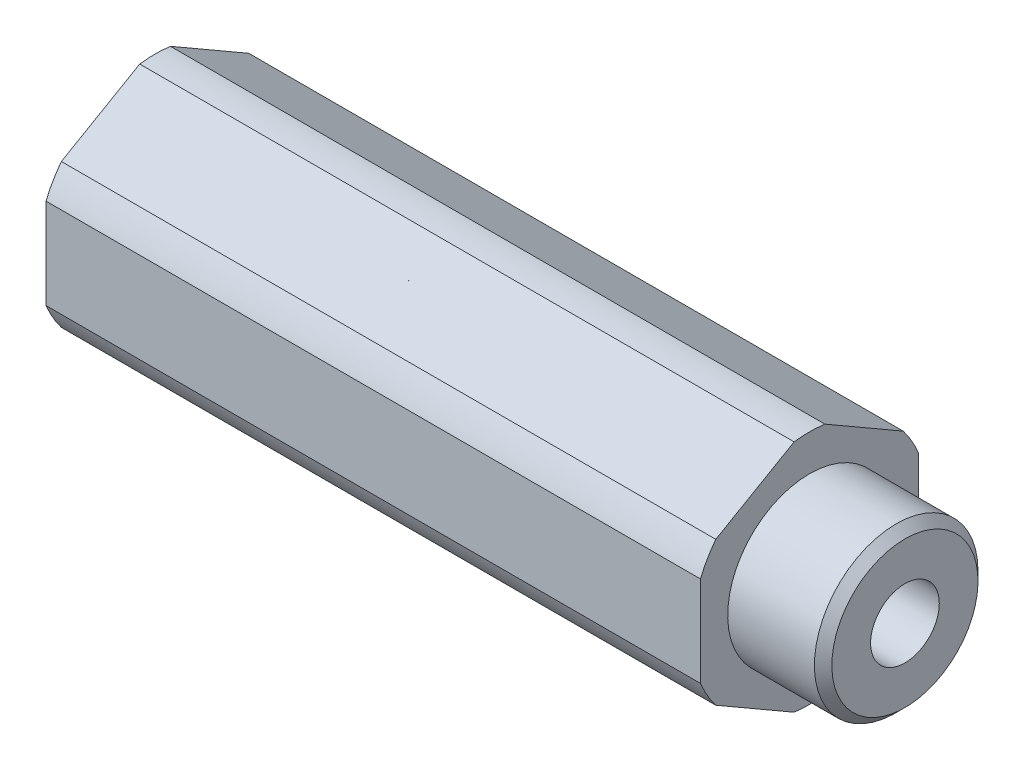
ISO-10303-21;
HEADER;
FILE_DESCRIPTION(('STEP AP214'),'2;1');
FILE_NAME('part.step','',(''),(''),'','','');
FILE_SCHEMA(('AUTOMOTIVE_DESIGN { 1 0 10303 214 1 1 1 1 }'));
ENDSEC;
DATA;
#1=APPLICATION_CONTEXT('core data for automotive mechanical design processes');
#2=APPLICATION_PROTOCOL_DEFINITION('international standard','automotive_design',2000,#1);
#3=PRODUCT_CONTEXT('',#1,'mechanical');
#4=PRODUCT('Part','Part','',(#3));
#5=PRODUCT_RELATED_PRODUCT_CATEGORY('part','',(#4));
#6=PRODUCT_DEFINITION_FORMATION('','',#4);
#7=PRODUCT_DEFINITION_CONTEXT('part definition',#1,'design');
#8=PRODUCT_DEFINITION('design','',#6,#7);
#9=PRODUCT_DEFINITION_SHAPE('','',#8);
#10=(LENGTH_UNIT() NAMED_UNIT(*) SI_UNIT(.MILLI.,.METRE.));
#11=(NAMED_UNIT(*) PLANE_ANGLE_UNIT() SI_UNIT($,.RADIAN.));
#12=(NAMED_UNIT(*) SI_UNIT($,.STERADIAN.) SOLID_ANGLE_UNIT());
#13=UNCERTAINTY_MEASURE_WITH_UNIT(LENGTH_MEASURE(1.E-05),#10,'distance_accuracy_value','');
#14=(GEOMETRIC_REPRESENTATION_CONTEXT(3) GLOBAL_UNCERTAINTY_ASSIGNED_CONTEXT((#13)) GLOBAL_UNIT_ASSIGNED_CONTEXT((#10,
#11,#12)) REPRESENTATION_CONTEXT('',''));
#15=CARTESIAN_POINT('',(0.,0.,0.));
#16=DIRECTION('',(0.,0.,1.));
#17=DIRECTION('',(1.,0.,0.));
#18=AXIS2_PLACEMENT_3D('',#15,#16,#17);
#19=CARTESIAN_POINT('',(-299.24375,102.462788395661,498.932814357697));
#20=DIRECTION('',(0.,-0.866025403784439,-0.5));
#21=DIRECTION('',(0.,0.5,-0.866025403784439));
#22=AXIS2_PLACEMENT_3D('',#19,#20,#21);
#23=PLANE('',#22);
#24=DIRECTION('',(0.,-0.5,0.866025403784439));
#25=VECTOR('',#24,1.);
#26=CARTESIAN_POINT('',(-304.8,102.462788395661,498.932814357697));
#27=LINE('',#26,#25);
#28=CARTESIAN_POINT('',(-304.8,103.779619652856,496.651995715241));
#29=VERTEX_POINT('',#28);
#30=CARTESIAN_POINT('',(-304.8,101.145957138466,501.213633000153));
#31=VERTEX_POINT('',#30);
#32=EDGE_CURVE('E34',#29,#31,#27,.T.);
#33=ORIENTED_EDGE('',*,*,#32,.F.);
#34=DIRECTION('',(-1.,0.,0.));
#35=VECTOR('',#34,1.);
#36=CARTESIAN_POINT('',(-299.24375,103.779619652856,496.651995715241));
#37=LINE('',#36,#35);
#38=CARTESIAN_POINT('',(-342.9,103.779619652856,496.651995715241));
#39=VERTEX_POINT('',#38);
#40=EDGE_CURVE('E216',#29,#39,#37,.T.);
#41=ORIENTED_EDGE('',*,*,#40,.T.);
#42=DIRECTION('',(0.,0.5,-0.866025403784438));
#43=VECTOR('',#42,1.);
#44=CARTESIAN_POINT('',(-342.9,102.462788395661,498.932814357697));
#45=LINE('',#44,#43);
#46=CARTESIAN_POINT('',(-342.9,101.145957138466,501.213633000153));
#47=VERTEX_POINT('',#46);
#48=EDGE_CURVE('E144',#47,#39,#45,.T.);
#49=ORIENTED_EDGE('',*,*,#48,.F.);
#50=DIRECTION('',(-1.,0.,0.));
#51=VECTOR('',#50,1.);
#52=CARTESIAN_POINT('',(-299.24375,101.145957138466,501.213633000153));
#53=LINE('',#52,#51);
#54=EDGE_CURVE('E219',#47,#31,#53,.F.);
#55=ORIENTED_EDGE('',*,*,#54,.T.);
#56=EDGE_LOOP('',(#33,#41,#49,#55));
#57=FACE_BOUND('',#56,.T.);
#58=ADVANCED_FACE('F17',(#57),#23,.F.);
#59=CARTESIAN_POINT('',(-299.24375,96.963053395661,502.108087840419));
#60=DIRECTION('',(0.,0.,-1.));
#61=DIRECTION('',(-1.,0.,0.));
#62=AXIS2_PLACEMENT_3D('',#59,#60,#61);
#63=PLANE('',#62);
#64=DIRECTION('',(0.,-1.,0.));
#65=VECTOR('',#64,1.);
#66=CARTESIAN_POINT('',(-304.8,96.963053395661,502.108087840419));
#67=LINE('',#66,#65);
#68=CARTESIAN_POINT('',(-304.8,99.5967159100504,502.108087840419));
#69=VERTEX_POINT('',#68);
#70=CARTESIAN_POINT('',(-304.8,94.3293908812717,502.108087840419));
#71=VERTEX_POINT('',#70);
#72=EDGE_CURVE('E158',#69,#71,#67,.T.);
#73=ORIENTED_EDGE('',*,*,#72,.F.);
#74=DIRECTION('',(-1.,0.,0.));
#75=VECTOR('',#74,1.);
#76=CARTESIAN_POINT('',(-299.24375,99.5967159100504,502.108087840419));
#77=LINE('',#76,#75);
#78=CARTESIAN_POINT('',(-342.9,99.5967159100504,502.108087840419));
#79=VERTEX_POINT('',#78);
#80=EDGE_CURVE('E119',#69,#79,#77,.T.);
#81=ORIENTED_EDGE('',*,*,#80,.T.);
#82=DIRECTION('',(0.,1.,0.));
#83=VECTOR('',#82,1.);
#84=CARTESIAN_POINT('',(-342.9,96.963053395661,502.108087840419));
#85=LINE('',#84,#83);
#86=CARTESIAN_POINT('',(-342.9,94.3293908812717,502.108087840419));
#87=VERTEX_POINT('',#86);
#88=EDGE_CURVE('E138',#87,#79,#85,.T.);
#89=ORIENTED_EDGE('',*,*,#88,.F.);
#90=DIRECTION('',(-1.,0.,0.));
#91=VECTOR('',#90,1.);
#92=CARTESIAN_POINT('',(-299.24375,94.3293908812717,502.108087840419));
#93=LINE('',#92,#91);
#94=EDGE_CURVE('E212',#87,#71,#93,.F.);
#95=ORIENTED_EDGE('',*,*,#94,.T.);
#96=EDGE_LOOP('',(#73,#81,#89,#95));
#97=FACE_BOUND('',#96,.T.);
#98=ADVANCED_FACE('F251',(#97),#63,.F.);
#99=CARTESIAN_POINT('',(-299.24375,91.463318395661,498.932814357697));
#100=DIRECTION('',(0.,0.866025403784438,-0.5));
#101=DIRECTION('',(0.,0.5,0.866025403784438));
#102=AXIS2_PLACEMENT_3D('',#99,#100,#101);
#103=PLANE('',#102);
#104=DIRECTION('',(0.,-0.5,-0.866025403784438));
#105=VECTOR('',#104,1.);
#106=CARTESIAN_POINT('',(-304.8,91.463318395661,498.932814357697));
#107=LINE('',#106,#105);
#108=CARTESIAN_POINT('',(-304.8,92.7801496528557,501.213633000153));
#109=VERTEX_POINT('',#108);
#110=CARTESIAN_POINT('',(-304.8,90.1464871384663,496.651995715241));
#111=VERTEX_POINT('',#110);
#112=EDGE_CURVE('E172',#109,#111,#107,.T.);
#113=ORIENTED_EDGE('',*,*,#112,.F.);
#114=DIRECTION('',(-1.,0.,0.));
#115=VECTOR('',#114,1.);
#116=CARTESIAN_POINT('',(-299.24375,92.7801496528557,501.213633000153));
#117=LINE('',#116,#115);
#118=CARTESIAN_POINT('',(-342.9,92.7801496528557,501.213633000153));
#119=VERTEX_POINT('',#118);
#120=EDGE_CURVE('E120',#109,#119,#117,.T.);
#121=ORIENTED_EDGE('',*,*,#120,.T.);
#122=DIRECTION('',(0.,0.5,0.86602540378444));
#123=VECTOR('',#122,1.);
#124=CARTESIAN_POINT('',(-342.9,91.463318395661,498.932814357697));
#125=LINE('',#124,#123);
#126=CARTESIAN_POINT('',(-342.9,90.1464871384663,496.651995715241));
#127=VERTEX_POINT('',#126);
#128=EDGE_CURVE('E126',#127,#119,#125,.T.);
#129=ORIENTED_EDGE('',*,*,#128,.F.);
#130=DIRECTION('',(-1.,0.,0.));
#131=VECTOR('',#130,1.);
#132=CARTESIAN_POINT('',(-299.24375,90.1464871384663,496.651995715241));
#133=LINE('',#132,#131);
#134=EDGE_CURVE('E108',#127,#111,#133,.F.);
#135=ORIENTED_EDGE('',*,*,#134,.T.);
#136=EDGE_LOOP('',(#113,#121,#129,#135));
#137=FACE_BOUND('',#136,.T.);
#138=ADVANCED_FACE('F134',(#137),#103,.F.);
#139=CARTESIAN_POINT('',(-299.24375,91.463318395661,492.582267392254));
#140=DIRECTION('',(0.,0.86602540378444,0.5));
#141=DIRECTION('',(0.,-0.5,0.86602540378444));
#142=AXIS2_PLACEMENT_3D('',#139,#140,#141);
#143=PLANE('',#142);
#144=DIRECTION('',(0.,0.5,-0.86602540378444));
#145=VECTOR('',#144,1.);
#146=CARTESIAN_POINT('',(-304.8,91.463318395661,492.582267392254));
#147=LINE('',#146,#145);
#148=CARTESIAN_POINT('',(-304.8,90.1464871384663,494.86308603471));
#149=VERTEX_POINT('',#148);
#150=CARTESIAN_POINT('',(-304.8,92.7801496528557,490.301448749798));
#151=VERTEX_POINT('',#150);
#152=EDGE_CURVE('E41',#149,#151,#147,.T.);
#153=ORIENTED_EDGE('',*,*,#152,.F.);
#154=DIRECTION('',(-1.,0.,0.));
#155=VECTOR('',#154,1.);
#156=CARTESIAN_POINT('',(-299.24375,90.1464871384663,494.86308603471));
#157=LINE('',#156,#155);
#158=CARTESIAN_POINT('',(-342.9,90.1464871384663,494.86308603471));
#159=VERTEX_POINT('',#158);
#160=EDGE_CURVE('E201',#149,#159,#157,.T.);
#161=ORIENTED_EDGE('',*,*,#160,.T.);
#162=DIRECTION('',(0.,-0.5,0.866025403784438));
#163=VECTOR('',#162,1.);
#164=CARTESIAN_POINT('',(-342.9,91.463318395661,492.582267392254));
#165=LINE('',#164,#163);
#166=CARTESIAN_POINT('',(-342.9,92.7801496528557,490.301448749798));
#167=VERTEX_POINT('',#166);
#168=EDGE_CURVE('E129',#167,#159,#165,.T.);
#169=ORIENTED_EDGE('',*,*,#168,.F.);
#170=DIRECTION('',(-1.,0.,0.));
#171=VECTOR('',#170,1.);
#172=CARTESIAN_POINT('',(-299.24375,92.7801496528557,490.301448749798));
#173=LINE('',#172,#171);
#174=EDGE_CURVE('E204',#167,#151,#173,.F.);
#175=ORIENTED_EDGE('',*,*,#174,.T.);
#176=EDGE_LOOP('',(#153,#161,#169,#175));
#177=FACE_BOUND('',#176,.T.);
#178=ADVANCED_FACE('F260',(#177),#143,.F.);
#179=CARTESIAN_POINT('',(-299.24375,96.963053395661,489.406993909532));
#180=DIRECTION('',(0.,0.,1.));
#181=DIRECTION('',(1.,0.,0.));
#182=AXIS2_PLACEMENT_3D('',#179,#180,#181);
#183=PLANE('',#182);
#184=DIRECTION('',(0.,1.,0.));
#185=VECTOR('',#184,1.);
#186=CARTESIAN_POINT('',(-304.8,96.963053395661,489.406993909532));
#187=LINE('',#186,#185);
#188=CARTESIAN_POINT('',(-304.8,94.3293908812717,489.406993909532));
#189=VERTEX_POINT('',#188);
#190=CARTESIAN_POINT('',(-304.8,99.5967159100504,489.406993909532));
#191=VERTEX_POINT('',#190);
#192=EDGE_CURVE('E179',#189,#191,#187,.T.);
#193=ORIENTED_EDGE('',*,*,#192,.F.);
#194=DIRECTION('',(-1.,0.,0.));
#195=VECTOR('',#194,1.);
#196=CARTESIAN_POINT('',(-299.24375,94.3293908812717,489.406993909532));
#197=LINE('',#196,#195);
#198=CARTESIAN_POINT('',(-342.9,94.3293908812717,489.406993909532));
#199=VERTEX_POINT('',#198);
#200=EDGE_CURVE('E194',#189,#199,#197,.T.);
#201=ORIENTED_EDGE('',*,*,#200,.T.);
#202=DIRECTION('',(0.,-1.,0.));
#203=VECTOR('',#202,1.);
#204=CARTESIAN_POINT('',(-342.9,96.963053395661,489.406993909532));
#205=LINE('',#204,#203);
#206=CARTESIAN_POINT('',(-342.9,99.5967159100504,489.406993909532));
#207=VERTEX_POINT('',#206);
#208=EDGE_CURVE('E147',#207,#199,#205,.T.);
#209=ORIENTED_EDGE('',*,*,#208,.F.);
#210=DIRECTION('',(-1.,0.,0.));
#211=VECTOR('',#210,1.);
#212=CARTESIAN_POINT('',(-299.24375,99.5967159100504,489.406993909532));
#213=LINE('',#212,#211);
#214=EDGE_CURVE('E197',#207,#191,#213,.F.);
#215=ORIENTED_EDGE('',*,*,#214,.T.);
#216=EDGE_LOOP('',(#193,#201,#209,#215));
#217=FACE_BOUND('',#216,.T.);
#218=ADVANCED_FACE('F263',(#217),#183,.F.);
#219=CARTESIAN_POINT('',(-299.24375,102.462788395661,492.582267392254));
#220=DIRECTION('',(0.,-0.866025403784438,0.5));
#221=DIRECTION('',(0.,-0.5,-0.866025403784438));
#222=AXIS2_PLACEMENT_3D('',#219,#220,#221);
#223=PLANE('',#222);
#224=DIRECTION('',(0.,0.5,0.866025403784438));
#225=VECTOR('',#224,1.);
#226=CARTESIAN_POINT('',(-304.8,102.462788395661,492.582267392254));
#227=LINE('',#226,#225);
#228=CARTESIAN_POINT('',(-304.8,101.145957138466,490.301448749798));
#229=VERTEX_POINT('',#228);
#230=CARTESIAN_POINT('',(-304.8,103.779619652856,494.86308603471));
#231=VERTEX_POINT('',#230);
#232=EDGE_CURVE('E169',#229,#231,#227,.T.);
#233=ORIENTED_EDGE('',*,*,#232,.F.);
#234=DIRECTION('',(-1.,0.,0.));
#235=VECTOR('',#234,1.);
#236=CARTESIAN_POINT('',(-299.24375,101.145957138466,490.301448749798));
#237=LINE('',#236,#235);
#238=CARTESIAN_POINT('',(-342.9,101.145957138466,490.301448749798));
#239=VERTEX_POINT('',#238);
#240=EDGE_CURVE('E187',#229,#239,#237,.T.);
#241=ORIENTED_EDGE('',*,*,#240,.T.);
#242=DIRECTION('',(0.,-0.5,-0.866025403784439));
#243=VECTOR('',#242,1.);
#244=CARTESIAN_POINT('',(-342.9,102.462788395661,492.582267392254));
#245=LINE('',#244,#243);
#246=CARTESIAN_POINT('',(-342.9,103.779619652856,494.86308603471));
#247=VERTEX_POINT('',#246);
#248=EDGE_CURVE('E302',#247,#239,#245,.T.);
#249=ORIENTED_EDGE('',*,*,#248,.F.);
#250=DIRECTION('',(-1.,0.,0.));
#251=VECTOR('',#250,1.);
#252=CARTESIAN_POINT('',(-299.24375,103.779619652856,494.86308603471));
#253=LINE('',#252,#251);
#254=EDGE_CURVE('E190',#247,#231,#253,.F.);
#255=ORIENTED_EDGE('',*,*,#254,.T.);
#256=EDGE_LOOP('',(#233,#241,#249,#255));
#257=FACE_BOUND('',#256,.T.);
#258=ADVANCED_FACE('F267',(#257),#223,.F.);
#259=CARTESIAN_POINT('',(-299.24375,96.963053395661,495.757540874975));
#260=DIRECTION('',(1.,0.,0.));
#261=DIRECTION('',(0.,1.,0.));
#262=AXIS2_PLACEMENT_3D('',#259,#260,#261);
#263=PLANE('',#262);
#264=CARTESIAN_POINT('',(-299.24375,96.963053395661,495.757540874975));
#265=DIRECTION('',(1.,0.,0.));
#266=DIRECTION('',(0.,1.,0.));
#267=AXIS2_PLACEMENT_3D('',#264,#265,#266);
#268=CIRCLE('',#267,4.2545);
#269=CARTESIAN_POINT('',(-299.24375,101.217553395661,495.757540874975));
#270=VERTEX_POINT('',#269);
#271=EDGE_CURVE('E27',#270,#270,#268,.T.);
#272=ORIENTED_EDGE('',*,*,#271,.T.);
#273=EDGE_LOOP('',(#272));
#274=FACE_BOUND('',#273,.T.);
#275=CARTESIAN_POINT('',(-299.24375,96.963053395661,495.757540874975));
#276=DIRECTION('',(1.,0.,0.));
#277=DIRECTION('',(0.,1.,0.));
#278=AXIS2_PLACEMENT_3D('',#275,#276,#277);
#279=CIRCLE('',#278,2.);
#280=CARTESIAN_POINT('',(-299.24375,98.963053395661,495.757540874975));
#281=VERTEX_POINT('',#280);
#282=EDGE_CURVE('E223',#281,#281,#279,.T.);
#283=ORIENTED_EDGE('',*,*,#282,.F.);
#284=EDGE_LOOP('',(#283));
#285=FACE_BOUND('',#284,.T.);
#286=ADVANCED_FACE('F234',(#274,#285),#263,.T.);
#287=CARTESIAN_POINT('',(-299.24375,96.963053395661,495.757540874975));
#288=DIRECTION('',(-1.,0.,0.));
#289=DIRECTION('',(0.,-1.,0.));
#290=AXIS2_PLACEMENT_3D('',#287,#288,#289);
#291=CYLINDRICAL_SURFACE('',#290,6.875);
#292=CARTESIAN_POINT('',(-304.8,96.963053395661,495.757540874975));
#293=DIRECTION('',(1.,0.,0.));
#294=DIRECTION('',(0.,1.,0.));
#295=AXIS2_PLACEMENT_3D('',#292,#293,#294);
#296=CIRCLE('',#295,6.875);
#297=EDGE_CURVE('E176',#191,#229,#296,.T.);
#298=ORIENTED_EDGE('',*,*,#297,.F.);
#299=ORIENTED_EDGE('',*,*,#214,.F.);
#300=CARTESIAN_POINT('',(-342.9,96.963053395661,495.757540874975));
#301=DIRECTION('',(-1.,0.,0.));
#302=DIRECTION('',(0.,-1.,0.));
#303=AXIS2_PLACEMENT_3D('',#300,#301,#302);
#304=CIRCLE('',#303,6.875);
#305=EDGE_CURVE('E297',#239,#207,#304,.T.);
#306=ORIENTED_EDGE('',*,*,#305,.F.);
#307=ORIENTED_EDGE('',*,*,#240,.F.);
#308=EDGE_LOOP('',(#298,#299,#306,#307));
#309=FACE_BOUND('',#308,.T.);
#310=ADVANCED_FACE('F274',(#309),#291,.T.);
#311=CARTESIAN_POINT('',(-304.8,96.963053395661,495.757540874975));
#312=DIRECTION('',(1.,0.,0.));
#313=DIRECTION('',(0.,1.,0.));
#314=AXIS2_PLACEMENT_3D('',#311,#312,#313);
#315=CIRCLE('',#314,6.875);
#316=EDGE_CURVE('E166',#231,#29,#315,.T.);
#317=ORIENTED_EDGE('',*,*,#316,.F.);
#318=ORIENTED_EDGE('',*,*,#254,.F.);
#319=EDGE_CURVE('E315',#39,#247,#304,.T.);
#320=ORIENTED_EDGE('',*,*,#319,.F.);
#321=ORIENTED_EDGE('',*,*,#40,.F.);
#322=EDGE_LOOP('',(#317,#318,#320,#321));
#323=FACE_BOUND('',#322,.T.);
#324=ADVANCED_FACE('F281',(#323),#291,.T.);
#325=CARTESIAN_POINT('',(-304.8,96.963053395661,495.757540874975));
#326=DIRECTION('',(1.,0.,0.));
#327=DIRECTION('',(0.,1.,0.));
#328=AXIS2_PLACEMENT_3D('',#325,#326,#327);
#329=CIRCLE('',#328,6.875);
#330=EDGE_CURVE('E184',#151,#189,#329,.T.);
#331=ORIENTED_EDGE('',*,*,#330,.F.);
#332=ORIENTED_EDGE('',*,*,#174,.F.);
#333=EDGE_CURVE('E131',#199,#167,#304,.T.);
#334=ORIENTED_EDGE('',*,*,#333,.F.);
#335=ORIENTED_EDGE('',*,*,#200,.F.);
#336=EDGE_LOOP('',(#331,#332,#334,#335));
#337=FACE_BOUND('',#336,.T.);
#338=ADVANCED_FACE('F294',(#337),#291,.T.);
#339=CARTESIAN_POINT('',(-304.8,96.963053395661,495.757540874975));
#340=DIRECTION('',(1.,0.,0.));
#341=DIRECTION('',(0.,1.,0.));
#342=AXIS2_PLACEMENT_3D('',#339,#340,#341);
#343=CIRCLE('',#342,6.875);
#344=EDGE_CURVE('E114',#111,#149,#343,.T.);
#345=ORIENTED_EDGE('',*,*,#344,.F.);
#346=ORIENTED_EDGE('',*,*,#134,.F.);
#347=EDGE_CURVE('E112',#159,#127,#304,.T.);
#348=ORIENTED_EDGE('',*,*,#347,.F.);
#349=ORIENTED_EDGE('',*,*,#160,.F.);
#350=EDGE_LOOP('',(#345,#346,#348,#349));
#351=FACE_BOUND('',#350,.T.);
#352=ADVANCED_FACE('F110',(#351),#291,.T.);
#353=CARTESIAN_POINT('',(-304.8,96.963053395661,495.757540874975));
#354=DIRECTION('',(1.,0.,0.));
#355=DIRECTION('',(0.,1.,0.));
#356=AXIS2_PLACEMENT_3D('',#353,#354,#355);
#357=CIRCLE('',#356,6.875);
#358=EDGE_CURVE('E163',#71,#109,#357,.T.);
#359=ORIENTED_EDGE('',*,*,#358,.F.);
#360=ORIENTED_EDGE('',*,*,#94,.F.);
#361=EDGE_CURVE('E133',#119,#87,#304,.T.);
#362=ORIENTED_EDGE('',*,*,#361,.F.);
#363=ORIENTED_EDGE('',*,*,#120,.F.);
#364=EDGE_LOOP('',(#359,#360,#362,#363));
#365=FACE_BOUND('',#364,.T.);
#366=ADVANCED_FACE('F335',(#365),#291,.T.);
#367=CARTESIAN_POINT('',(-304.8,96.963053395661,495.757540874975));
#368=DIRECTION('',(1.,0.,0.));
#369=DIRECTION('',(0.,1.,0.));
#370=AXIS2_PLACEMENT_3D('',#367,#368,#369);
#371=CIRCLE('',#370,6.875);
#372=EDGE_CURVE('E227',#31,#69,#371,.T.);
#373=ORIENTED_EDGE('',*,*,#372,.F.);
#374=ORIENTED_EDGE('',*,*,#54,.F.);
#375=EDGE_CURVE('E311',#79,#47,#304,.T.);
#376=ORIENTED_EDGE('',*,*,#375,.F.);
#377=ORIENTED_EDGE('',*,*,#80,.F.);
#378=EDGE_LOOP('',(#373,#374,#376,#377));
#379=FACE_BOUND('',#378,.T.);
#380=ADVANCED_FACE('F278',(#379),#291,.T.);
#381=CARTESIAN_POINT('',(-299.24375,96.963053395661,495.757540874975));
#382=DIRECTION('',(-1.,0.,0.));
#383=DIRECTION('',(0.,-1.,0.));
#384=AXIS2_PLACEMENT_3D('',#381,#382,#383);
#385=CYLINDRICAL_SURFACE('',#384,2.);
#386=ORIENTED_EDGE('',*,*,#282,.T.);
#387=EDGE_LOOP('',(#386));
#388=FACE_BOUND('',#387,.T.);
#389=CARTESIAN_POINT('',(-342.9,96.963053395661,495.757540874975));
#390=DIRECTION('',(-1.,0.,0.));
#391=DIRECTION('',(0.,-1.,0.));
#392=AXIS2_PLACEMENT_3D('',#389,#390,#391);
#393=CIRCLE('',#392,2.);
#394=CARTESIAN_POINT('',(-342.9,94.963053395661,495.757540874975));
#395=VERTEX_POINT('',#394);
#396=EDGE_CURVE('E304',#395,#395,#393,.T.);
#397=ORIENTED_EDGE('',*,*,#396,.T.);
#398=EDGE_LOOP('',(#397));
#399=FACE_BOUND('',#398,.T.);
#400=ADVANCED_FACE('F275',(#388,#399),#385,.F.);
#401=CARTESIAN_POINT('',(-304.8,96.963053395661,495.757540874975));
#402=DIRECTION('',(1.,0.,0.));
#403=DIRECTION('',(0.,1.,0.));
#404=AXIS2_PLACEMENT_3D('',#401,#402,#403);
#405=PLANE('',#404);
#406=CARTESIAN_POINT('',(-304.8,96.963053395661,495.757540874975));
#407=DIRECTION('',(1.,0.,0.));
#408=DIRECTION('',(0.,1.,0.));
#409=AXIS2_PLACEMENT_3D('',#406,#407,#408);
#410=CIRCLE('',#409,4.7625);
#411=CARTESIAN_POINT('',(-304.8,101.725553395661,495.757540874975));
#412=VERTEX_POINT('',#411);
#413=EDGE_CURVE('E154',#412,#412,#410,.T.);
#414=ORIENTED_EDGE('',*,*,#413,.F.);
#415=EDGE_LOOP('',(#414));
#416=FACE_BOUND('',#415,.T.);
#417=ORIENTED_EDGE('',*,*,#330,.T.);
#418=ORIENTED_EDGE('',*,*,#192,.T.);
#419=ORIENTED_EDGE('',*,*,#297,.T.);
#420=ORIENTED_EDGE('',*,*,#232,.T.);
#421=ORIENTED_EDGE('',*,*,#316,.T.);
#422=ORIENTED_EDGE('',*,*,#32,.T.);
#423=ORIENTED_EDGE('',*,*,#372,.T.);
#424=ORIENTED_EDGE('',*,*,#72,.T.);
#425=ORIENTED_EDGE('',*,*,#358,.T.);
#426=ORIENTED_EDGE('',*,*,#112,.T.);
#427=ORIENTED_EDGE('',*,*,#344,.T.);
#428=ORIENTED_EDGE('',*,*,#152,.T.);
#429=EDGE_LOOP('',(#417,#418,#419,#420,#421,#422,#423,#424,#425,#426,#427,#428));
#430=FACE_BOUND('',#429,.T.);
#431=ADVANCED_FACE('F246',(#416,#430),#405,.T.);
#432=CARTESIAN_POINT('',(-304.8,96.963053395661,495.757540874975));
#433=DIRECTION('',(1.,0.,0.));
#434=DIRECTION('',(0.,1.,0.));
#435=AXIS2_PLACEMENT_3D('',#432,#433,#434);
#436=CYLINDRICAL_SURFACE('',#435,4.7625);
#437=CARTESIAN_POINT('',(-299.75175,96.963053395661,495.757540874975));
#438=DIRECTION('',(1.,0.,0.));
#439=DIRECTION('',(0.,0.,-1.));
#440=AXIS2_PLACEMENT_3D('',#437,#438,#439);
#441=CIRCLE('',#440,4.7625);
#442=CARTESIAN_POINT('',(-299.75175,96.963053395661,490.995040874975));
#443=VERTEX_POINT('',#442);
#444=EDGE_CURVE('E11',#443,#443,#441,.F.);
#445=ORIENTED_EDGE('',*,*,#444,.T.);
#446=EDGE_LOOP('',(#445));
#447=FACE_BOUND('',#446,.T.);
#448=ORIENTED_EDGE('',*,*,#413,.T.);
#449=EDGE_LOOP('',(#448));
#450=FACE_BOUND('',#449,.T.);
#451=ADVANCED_FACE('F238',(#447,#450),#436,.T.);
#452=CARTESIAN_POINT('',(-299.24375,96.963053395661,495.757540874975));
#453=DIRECTION('',(-1.,0.,0.));
#454=DIRECTION('',(0.,0.,1.));
#455=AXIS2_PLACEMENT_3D('',#452,#453,#454);
#456=CONICAL_SURFACE('',#455,4.2545,0.785398163397434);
#457=ORIENTED_EDGE('',*,*,#444,.F.);
#458=EDGE_LOOP('',(#457));
#459=FACE_BOUND('',#458,.T.);
#460=ORIENTED_EDGE('',*,*,#271,.F.);
#461=EDGE_LOOP('',(#460));
#462=FACE_BOUND('',#461,.T.);
#463=ADVANCED_FACE('F20',(#459,#462),#456,.T.);
#464=CARTESIAN_POINT('',(-342.9,96.963053395661,495.757540874975));
#465=DIRECTION('',(-1.,0.,0.));
#466=DIRECTION('',(0.,1.,0.));
#467=AXIS2_PLACEMENT_3D('',#464,#465,#466);
#468=PLANE('',#467);
#469=ORIENTED_EDGE('',*,*,#396,.F.);
#470=EDGE_LOOP('',(#469));
#471=FACE_BOUND('',#470,.T.);
#472=ORIENTED_EDGE('',*,*,#128,.T.);
#473=ORIENTED_EDGE('',*,*,#361,.T.);
#474=ORIENTED_EDGE('',*,*,#88,.T.);
#475=ORIENTED_EDGE('',*,*,#375,.T.);
#476=ORIENTED_EDGE('',*,*,#48,.T.);
#477=ORIENTED_EDGE('',*,*,#319,.T.);
#478=ORIENTED_EDGE('',*,*,#248,.T.);
#479=ORIENTED_EDGE('',*,*,#305,.T.);
#480=ORIENTED_EDGE('',*,*,#208,.T.);
#481=ORIENTED_EDGE('',*,*,#333,.T.);
#482=ORIENTED_EDGE('',*,*,#168,.T.);
#483=ORIENTED_EDGE('',*,*,#347,.T.);
#484=EDGE_LOOP('',(#472,#473,#474,#475,#476,#477,#478,#479,#480,#481,#482,#483));
#485=FACE_BOUND('',#484,.T.);
#486=ADVANCED_FACE('F124',(#471,#485),#468,.T.);
#487=CLOSED_SHELL('',(#58,#98,#138,#178,#218,#258,#286,#310,#324,#338,#352,#366,#380,#400,#431,
#451,#463,#486));
#488=MANIFOLD_SOLID_BREP('B1',#487);
#489=ADVANCED_BREP_SHAPE_REPRESENTATION('',(#18,#488),#14);
#490=SHAPE_DEFINITION_REPRESENTATION(#9,#489);
ENDSEC;
END-ISO-10303-21;
